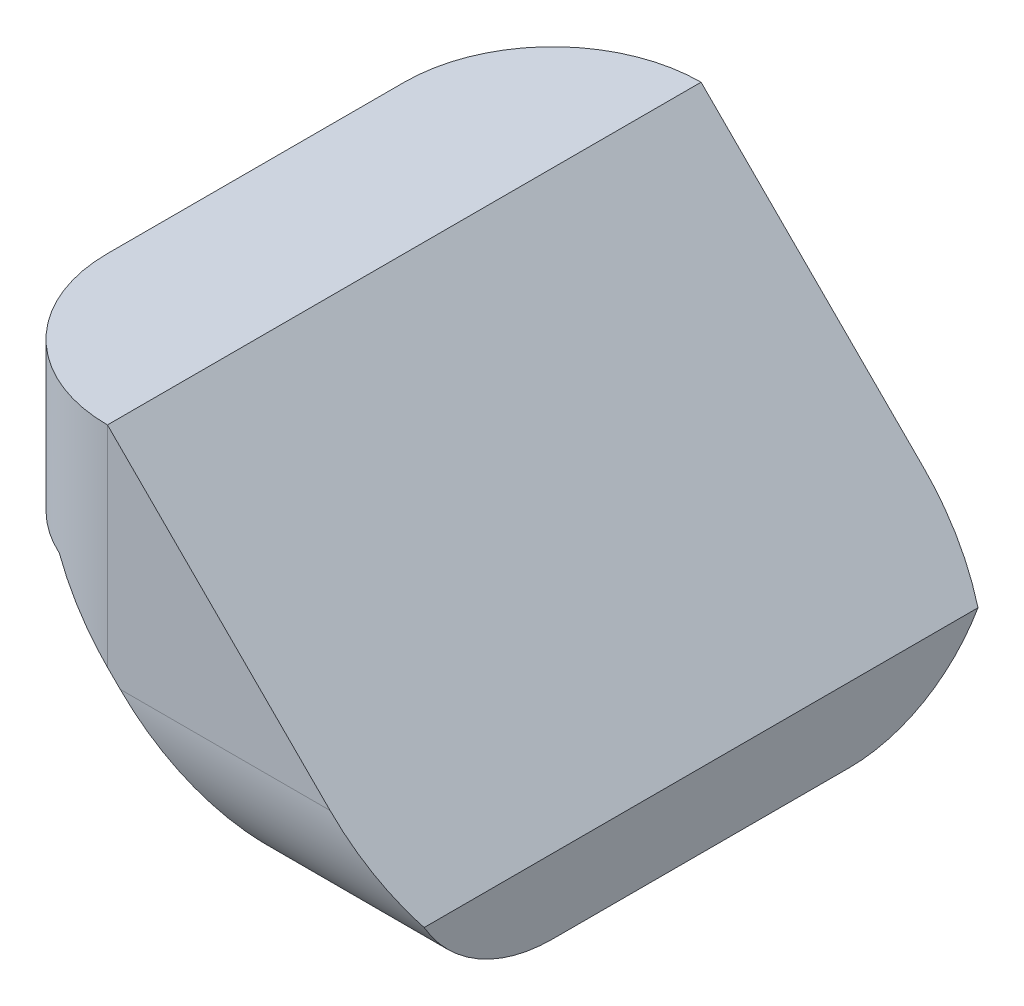
ISO-10303-21;
HEADER;
FILE_DESCRIPTION(('STEP AP214'),'2;1');
FILE_NAME('part.step','',(''),(''),'','','');
FILE_SCHEMA(('AUTOMOTIVE_DESIGN { 1 0 10303 214 1 1 1 1 }'));
ENDSEC;
DATA;
#1=APPLICATION_CONTEXT('core data for automotive mechanical design processes');
#2=APPLICATION_PROTOCOL_DEFINITION('international standard','automotive_design',2000,#1);
#3=PRODUCT_CONTEXT('',#1,'mechanical');
#4=PRODUCT('Part','Part','',(#3));
#5=PRODUCT_RELATED_PRODUCT_CATEGORY('part','',(#4));
#6=PRODUCT_DEFINITION_FORMATION('','',#4);
#7=PRODUCT_DEFINITION_CONTEXT('part definition',#1,'design');
#8=PRODUCT_DEFINITION('design','',#6,#7);
#9=PRODUCT_DEFINITION_SHAPE('','',#8);
#10=(LENGTH_UNIT() NAMED_UNIT(*) SI_UNIT(.MILLI.,.METRE.));
#11=(NAMED_UNIT(*) PLANE_ANGLE_UNIT() SI_UNIT($,.RADIAN.));
#12=(NAMED_UNIT(*) SI_UNIT($,.STERADIAN.) SOLID_ANGLE_UNIT());
#13=UNCERTAINTY_MEASURE_WITH_UNIT(LENGTH_MEASURE(1.E-05),#10,'distance_accuracy_value','');
#14=(GEOMETRIC_REPRESENTATION_CONTEXT(3) GLOBAL_UNCERTAINTY_ASSIGNED_CONTEXT((#13)) GLOBAL_UNIT_ASSIGNED_CONTEXT((#10,
#11,#12)) REPRESENTATION_CONTEXT('',''));
#15=CARTESIAN_POINT('',(0.,0.,0.));
#16=DIRECTION('',(0.,0.,1.));
#17=DIRECTION('',(1.,0.,0.));
#18=AXIS2_PLACEMENT_3D('',#15,#16,#17);
#19=CARTESIAN_POINT('',(-6.105,-0.06,4.095));
#20=DIRECTION('',(0.,-1.,0.));
#21=DIRECTION('',(0.,0.,-1.));
#22=AXIS2_PLACEMENT_3D('',#19,#20,#21);
#23=PLANE('',#22);
#24=CARTESIAN_POINT('',(-3.96,-0.06,1.95000000000028));
#25=DIRECTION('',(0.,1.,0.));
#26=DIRECTION('',(1.,0.,0.));
#27=AXIS2_PLACEMENT_3D('',#24,#25,#26);
#28=CIRCLE('',#27,1.95);
#29=CARTESIAN_POINT('',(-3.95999999999999,-0.06,3.90000000000029));
#30=VERTEX_POINT('',#29);
#31=CARTESIAN_POINT('',(-5.91,-0.06,1.95000000000028));
#32=VERTEX_POINT('',#31);
#33=EDGE_CURVE('E136',#30,#32,#28,.F.);
#34=ORIENTED_EDGE('',*,*,#33,.F.);
#35=DIRECTION('',(0.,0.,-1.));
#36=VECTOR('',#35,1.);
#37=CARTESIAN_POINT('',(-3.96,-0.06,4.095));
#38=LINE('',#37,#36);
#39=CARTESIAN_POINT('',(-3.95999999999999,-0.06,-3.89999999999972));
#40=VERTEX_POINT('',#39);
#41=EDGE_CURVE('E131',#30,#40,#38,.T.);
#42=ORIENTED_EDGE('',*,*,#41,.T.);
#43=CARTESIAN_POINT('',(-3.96,-0.06,-1.94999999999972));
#44=DIRECTION('',(0.,1.,0.));
#45=DIRECTION('',(1.,0.,0.));
#46=AXIS2_PLACEMENT_3D('',#43,#44,#45);
#47=CIRCLE('',#46,1.95);
#48=CARTESIAN_POINT('',(-5.91,-0.06,-1.94999999999972));
#49=VERTEX_POINT('',#48);
#50=EDGE_CURVE('E103',#49,#40,#47,.F.);
#51=ORIENTED_EDGE('',*,*,#50,.F.);
#52=DIRECTION('',(0.,0.,1.));
#53=VECTOR('',#52,1.);
#54=CARTESIAN_POINT('',(-5.91,-0.06,-3.89999999999972));
#55=LINE('',#54,#53);
#56=EDGE_CURVE('E40',#49,#32,#55,.T.);
#57=ORIENTED_EDGE('',*,*,#56,.T.);
#58=EDGE_LOOP('',(#34,#42,#51,#57));
#59=FACE_BOUND('',#58,.T.);
#60=ADVANCED_FACE('F17',(#59),#23,.F.);
#61=CARTESIAN_POINT('',(-3.96,-0.06,4.095));
#62=DIRECTION('',(-0.707106781186548,-0.707106781186548,0.));
#63=DIRECTION('',(0.707106781186548,-0.707106781186548,0.));
#64=AXIS2_PLACEMENT_3D('',#61,#62,#63);
#65=PLANE('',#64);
#66=DIRECTION('',(0.707106781186546,-0.707106781186549,0.));
#67=VECTOR('',#66,1.);
#68=CARTESIAN_POINT('',(-3.95999999999999,-0.06,3.90000000000028));
#69=LINE('',#68,#67);
#70=CARTESIAN_POINT('',(-1.035,-2.985,3.90000000000028));
#71=VERTEX_POINT('',#70);
#72=EDGE_CURVE('E187',#30,#71,#69,.T.);
#73=ORIENTED_EDGE('',*,*,#72,.T.);
#74=CARTESIAN_POINT('',(-1.03500000000001,-2.985,1.95000000000028));
#75=DIRECTION('',(0.707106781186549,0.707106781186546,0.));
#76=DIRECTION('',(0.707106781186546,-0.707106781186549,0.));
#77=AXIS2_PLACEMENT_3D('',#74,#75,#76);
#78=ELLIPSE('',#77,2.75771644662753,1.95);
#79=CARTESIAN_POINT('',(-0.06,-3.96,3.63874953737993));
#80=VERTEX_POINT('',#79);
#81=EDGE_CURVE('E201',#80,#71,#78,.F.);
#82=ORIENTED_EDGE('',*,*,#81,.F.);
#83=DIRECTION('',(0.,0.,-1.));
#84=VECTOR('',#83,1.);
#85=CARTESIAN_POINT('',(-0.06,-3.96,4.095));
#86=LINE('',#85,#84);
#87=CARTESIAN_POINT('',(-0.06,-3.96,-3.63874953737937));
#88=VERTEX_POINT('',#87);
#89=EDGE_CURVE('E137',#80,#88,#86,.T.);
#90=ORIENTED_EDGE('',*,*,#89,.T.);
#91=CARTESIAN_POINT('',(-1.03500000000001,-2.985,-1.94999999999972));
#92=DIRECTION('',(0.707106781186549,0.707106781186546,0.));
#93=DIRECTION('',(-0.707106781186546,0.707106781186549,0.));
#94=AXIS2_PLACEMENT_3D('',#91,#92,#93);
#95=ELLIPSE('',#94,2.75771644662753,1.95);
#96=CARTESIAN_POINT('',(-1.035,-2.985,-3.89999999999972));
#97=VERTEX_POINT('',#96);
#98=EDGE_CURVE('E133',#97,#88,#95,.F.);
#99=ORIENTED_EDGE('',*,*,#98,.F.);
#100=DIRECTION('',(-0.707106781186546,0.707106781186549,0.));
#101=VECTOR('',#100,1.);
#102=CARTESIAN_POINT('',(-3.95999999999999,-0.06,-3.89999999999972));
#103=LINE('',#102,#101);
#104=EDGE_CURVE('E119',#97,#40,#103,.T.);
#105=ORIENTED_EDGE('',*,*,#104,.T.);
#106=ORIENTED_EDGE('',*,*,#41,.F.);
#107=EDGE_LOOP('',(#73,#82,#90,#99,#105,#106));
#108=FACE_BOUND('',#107,.T.);
#109=ADVANCED_FACE('F130',(#108),#65,.F.);
#110=CARTESIAN_POINT('',(-0.06,-3.96,4.095));
#111=DIRECTION('',(-1.,0.,0.));
#112=DIRECTION('',(0.,0.,1.));
#113=AXIS2_PLACEMENT_3D('',#110,#111,#112);
#114=PLANE('',#113);
#115=CARTESIAN_POINT('',(-0.06,-2.985,1.95000000000028));
#116=DIRECTION('',(-1.,0.,0.));
#117=DIRECTION('',(0.,0.,1.));
#118=AXIS2_PLACEMENT_3D('',#115,#116,#117);
#119=CIRCLE('',#118,1.95);
#120=CARTESIAN_POINT('',(-0.0600000000000068,-4.935,1.95000000000028));
#121=VERTEX_POINT('',#120);
#122=EDGE_CURVE('E199',#121,#80,#119,.T.);
#123=ORIENTED_EDGE('',*,*,#122,.F.);
#124=DIRECTION('',(0.,0.,-1.));
#125=VECTOR('',#124,1.);
#126=CARTESIAN_POINT('',(-0.0600000000000068,-4.935,-3.89999999999972));
#127=LINE('',#126,#125);
#128=CARTESIAN_POINT('',(-0.0600000000000068,-4.935,-1.94999999999972));
#129=VERTEX_POINT('',#128);
#130=EDGE_CURVE('E208',#121,#129,#127,.T.);
#131=ORIENTED_EDGE('',*,*,#130,.T.);
#132=CARTESIAN_POINT('',(-0.06,-2.985,-1.94999999999972));
#133=DIRECTION('',(-1.,0.,0.));
#134=DIRECTION('',(0.,0.,1.));
#135=AXIS2_PLACEMENT_3D('',#132,#133,#134);
#136=CIRCLE('',#135,1.95);
#137=EDGE_CURVE('E160',#88,#129,#136,.T.);
#138=ORIENTED_EDGE('',*,*,#137,.F.);
#139=ORIENTED_EDGE('',*,*,#89,.F.);
#140=EDGE_LOOP('',(#123,#131,#138,#139));
#141=FACE_BOUND('',#140,.T.);
#142=ADVANCED_FACE('F216',(#141),#114,.F.);
#143=CARTESIAN_POINT('',(-5.91,-4.935,-3.89999999999972));
#144=DIRECTION('',(-1.,0.,0.));
#145=DIRECTION('',(0.,0.,1.));
#146=AXIS2_PLACEMENT_3D('',#143,#144,#145);
#147=PLANE('',#146);
#148=ORIENTED_EDGE('',*,*,#56,.F.);
#149=DIRECTION('',(0.,1.,0.));
#150=VECTOR('',#149,1.);
#151=CARTESIAN_POINT('',(-5.91,-0.06,-1.94999999999972));
#152=LINE('',#151,#150);
#153=CARTESIAN_POINT('',(-5.91,-2.01,-1.94999999999972));
#154=VERTEX_POINT('',#153);
#155=EDGE_CURVE('E108',#154,#49,#152,.T.);
#156=ORIENTED_EDGE('',*,*,#155,.F.);
#157=DIRECTION('',(0.,0.,1.));
#158=VECTOR('',#157,1.);
#159=CARTESIAN_POINT('',(-5.91,-2.01,-28.2749999999997));
#160=LINE('',#159,#158);
#161=CARTESIAN_POINT('',(-5.91,-2.01,1.95000000000028));
#162=VERTEX_POINT('',#161);
#163=EDGE_CURVE('E175',#154,#162,#160,.T.);
#164=ORIENTED_EDGE('',*,*,#163,.T.);
#165=DIRECTION('',(0.,1.,0.));
#166=VECTOR('',#165,1.);
#167=CARTESIAN_POINT('',(-5.91,-2.01,1.95000000000028));
#168=LINE('',#167,#166);
#169=EDGE_CURVE('E197',#32,#162,#168,.F.);
#170=ORIENTED_EDGE('',*,*,#169,.F.);
#171=EDGE_LOOP('',(#148,#156,#164,#170));
#172=FACE_BOUND('',#171,.T.);
#173=ADVANCED_FACE('F224',(#172),#147,.T.);
#174=CARTESIAN_POINT('',(-0.0600000000000068,-4.935,-3.89999999999972));
#175=DIRECTION('',(0.,0.,-1.));
#176=DIRECTION('',(-1.,0.,0.));
#177=AXIS2_PLACEMENT_3D('',#174,#175,#176);
#178=PLANE('',#177);
#179=DIRECTION('',(-0.707106781186546,0.707106781186549,0.));
#180=VECTOR('',#179,1.);
#181=CARTESIAN_POINT('',(-2.01000000000001,-4.76771644662753,-3.89999999999972));
#182=LINE('',#181,#180);
#183=CARTESIAN_POINT('',(-3.79271644662754,-2.985,-3.89999999999972));
#184=VERTEX_POINT('',#183);
#185=CARTESIAN_POINT('',(-3.96,-2.81771644662753,-3.89999999999972));
#186=VERTEX_POINT('',#185);
#187=EDGE_CURVE('E122',#184,#186,#182,.T.);
#188=ORIENTED_EDGE('',*,*,#187,.T.);
#189=DIRECTION('',(0.,1.,0.));
#190=VECTOR('',#189,1.);
#191=CARTESIAN_POINT('',(-3.96,-2.01,-3.89999999999972));
#192=LINE('',#191,#190);
#193=EDGE_CURVE('E106',#40,#186,#192,.F.);
#194=ORIENTED_EDGE('',*,*,#193,.F.);
#195=ORIENTED_EDGE('',*,*,#104,.F.);
#196=DIRECTION('',(-1.,0.,0.));
#197=VECTOR('',#196,1.);
#198=CARTESIAN_POINT('',(-0.0600000000000068,-2.985,-3.89999999999972));
#199=LINE('',#198,#197);
#200=EDGE_CURVE('E124',#184,#97,#199,.F.);
#201=ORIENTED_EDGE('',*,*,#200,.F.);
#202=EDGE_LOOP('',(#188,#194,#195,#201));
#203=FACE_BOUND('',#202,.T.);
#204=ADVANCED_FACE('F117',(#203),#178,.T.);
#205=CARTESIAN_POINT('',(-0.0600000000000068,-4.935,3.90000000000028));
#206=DIRECTION('',(0.,0.,1.));
#207=DIRECTION('',(1.,0.,0.));
#208=AXIS2_PLACEMENT_3D('',#205,#206,#207);
#209=PLANE('',#208);
#210=ORIENTED_EDGE('',*,*,#72,.F.);
#211=DIRECTION('',(0.,1.,0.));
#212=VECTOR('',#211,1.);
#213=CARTESIAN_POINT('',(-3.96,-0.06,3.90000000000028));
#214=LINE('',#213,#212);
#215=CARTESIAN_POINT('',(-3.96,-2.81771644662753,3.90000000000028));
#216=VERTEX_POINT('',#215);
#217=EDGE_CURVE('E182',#216,#30,#214,.T.);
#218=ORIENTED_EDGE('',*,*,#217,.F.);
#219=DIRECTION('',(0.707106781186546,-0.707106781186549,0.));
#220=VECTOR('',#219,1.);
#221=CARTESIAN_POINT('',(-2.01000000000001,-4.76771644662753,3.90000000000028));
#222=LINE('',#221,#220);
#223=CARTESIAN_POINT('',(-3.79271644662754,-2.985,3.90000000000028));
#224=VERTEX_POINT('',#223);
#225=EDGE_CURVE('E178',#216,#224,#222,.T.);
#226=ORIENTED_EDGE('',*,*,#225,.T.);
#227=DIRECTION('',(1.,0.,0.));
#228=VECTOR('',#227,1.);
#229=CARTESIAN_POINT('',(-0.0600000000000068,-2.985,3.90000000000028));
#230=LINE('',#229,#228);
#231=EDGE_CURVE('E125',#71,#224,#230,.F.);
#232=ORIENTED_EDGE('',*,*,#231,.F.);
#233=EDGE_LOOP('',(#210,#218,#226,#232));
#234=FACE_BOUND('',#233,.T.);
#235=ADVANCED_FACE('F185',(#234),#209,.T.);
#236=CARTESIAN_POINT('',(-54.1560238568588,-4.935,0.164761431411837));
#237=DIRECTION('',(0.,1.,0.));
#238=DIRECTION('',(1.,0.,0.));
#239=AXIS2_PLACEMENT_3D('',#236,#237,#238);
#240=PLANE('',#239);
#241=DIRECTION('',(0.,0.,1.));
#242=VECTOR('',#241,1.);
#243=CARTESIAN_POINT('',(-2.01000000000001,-4.935,-28.2749999999997));
#244=LINE('',#243,#242);
#245=CARTESIAN_POINT('',(-2.01,-4.935,-1.94999999999972));
#246=VERTEX_POINT('',#245);
#247=CARTESIAN_POINT('',(-2.01,-4.935,1.95000000000028));
#248=VERTEX_POINT('',#247);
#249=EDGE_CURVE('E32',#246,#248,#244,.T.);
#250=ORIENTED_EDGE('',*,*,#249,.F.);
#251=DIRECTION('',(-1.,0.,0.));
#252=VECTOR('',#251,1.);
#253=CARTESIAN_POINT('',(-54.1560238568588,-4.935,-1.94999999999972));
#254=LINE('',#253,#252);
#255=EDGE_CURVE('E191',#129,#246,#254,.T.);
#256=ORIENTED_EDGE('',*,*,#255,.F.);
#257=ORIENTED_EDGE('',*,*,#130,.F.);
#258=DIRECTION('',(1.,0.,0.));
#259=VECTOR('',#258,1.);
#260=CARTESIAN_POINT('',(-54.1560238568588,-4.935,1.95000000000028));
#261=LINE('',#260,#259);
#262=EDGE_CURVE('E188',#248,#121,#261,.T.);
#263=ORIENTED_EDGE('',*,*,#262,.F.);
#264=EDGE_LOOP('',(#250,#256,#257,#263));
#265=FACE_BOUND('',#264,.T.);
#266=ADVANCED_FACE('F206',(#265),#240,.F.);
#267=CARTESIAN_POINT('',(-54.1560238568588,-2.985,1.95000000000028));
#268=DIRECTION('',(1.,0.,0.));
#269=DIRECTION('',(0.,0.,-1.));
#270=AXIS2_PLACEMENT_3D('',#267,#268,#269);
#271=CYLINDRICAL_SURFACE('',#270,1.95);
#272=CARTESIAN_POINT('',(-3.79271644662753,-2.985,1.95000000000028));
#273=DIRECTION('',(0.707106781186549,0.707106781186546,0.));
#274=DIRECTION('',(0.707106781186546,-0.707106781186549,0.));
#275=AXIS2_PLACEMENT_3D('',#272,#273,#274);
#276=ELLIPSE('',#275,2.75771644662753,1.95);
#277=CARTESIAN_POINT('',(-2.01,-4.76771644662753,2.74020381606528));
#278=VERTEX_POINT('',#277);
#279=EDGE_CURVE('E156',#224,#278,#276,.T.);
#280=ORIENTED_EDGE('',*,*,#279,.T.);
#281=CARTESIAN_POINT('',(-2.01,-2.985,1.95000000000028));
#282=DIRECTION('',(1.,0.,0.));
#283=DIRECTION('',(0.,0.,-1.));
#284=AXIS2_PLACEMENT_3D('',#281,#282,#283);
#285=CIRCLE('',#284,1.95);
#286=EDGE_CURVE('E150',#278,#248,#285,.T.);
#287=ORIENTED_EDGE('',*,*,#286,.T.);
#288=ORIENTED_EDGE('',*,*,#262,.T.);
#289=ORIENTED_EDGE('',*,*,#122,.T.);
#290=ORIENTED_EDGE('',*,*,#81,.T.);
#291=ORIENTED_EDGE('',*,*,#231,.T.);
#292=EDGE_LOOP('',(#280,#287,#288,#289,#290,#291));
#293=FACE_BOUND('',#292,.T.);
#294=ADVANCED_FACE('F204',(#293),#271,.T.);
#295=CARTESIAN_POINT('',(-54.1560238568588,-2.985,-1.94999999999972));
#296=DIRECTION('',(-1.,0.,0.));
#297=DIRECTION('',(0.,0.,1.));
#298=AXIS2_PLACEMENT_3D('',#295,#296,#297);
#299=CYLINDRICAL_SURFACE('',#298,1.95);
#300=ORIENTED_EDGE('',*,*,#98,.T.);
#301=ORIENTED_EDGE('',*,*,#137,.T.);
#302=ORIENTED_EDGE('',*,*,#255,.T.);
#303=CARTESIAN_POINT('',(-2.01000000000001,-2.985,-1.94999999999972));
#304=DIRECTION('',(1.,0.,0.));
#305=DIRECTION('',(0.,0.,-1.));
#306=AXIS2_PLACEMENT_3D('',#303,#304,#305);
#307=CIRCLE('',#306,1.95);
#308=CARTESIAN_POINT('',(-2.01000000000001,-4.76771644662753,-2.74020381606471));
#309=VERTEX_POINT('',#308);
#310=EDGE_CURVE('E149',#246,#309,#307,.T.);
#311=ORIENTED_EDGE('',*,*,#310,.T.);
#312=CARTESIAN_POINT('',(-3.79271644662753,-2.985,-1.94999999999972));
#313=DIRECTION('',(0.707106781186549,0.707106781186546,0.));
#314=DIRECTION('',(-0.707106781186546,0.707106781186549,0.));
#315=AXIS2_PLACEMENT_3D('',#312,#313,#314);
#316=ELLIPSE('',#315,2.75771644662753,1.95);
#317=EDGE_CURVE('E157',#309,#184,#316,.T.);
#318=ORIENTED_EDGE('',*,*,#317,.T.);
#319=ORIENTED_EDGE('',*,*,#200,.T.);
#320=EDGE_LOOP('',(#300,#301,#302,#311,#318,#319));
#321=FACE_BOUND('',#320,.T.);
#322=ADVANCED_FACE('F213',(#321),#299,.T.);
#323=CARTESIAN_POINT('',(-3.96,-4.935,1.95000000000028));
#324=DIRECTION('',(0.,-1.,0.));
#325=DIRECTION('',(-1.,0.,0.));
#326=AXIS2_PLACEMENT_3D('',#323,#324,#325);
#327=CYLINDRICAL_SURFACE('',#326,1.95);
#328=CARTESIAN_POINT('',(-3.96,-2.01,1.95000000000028));
#329=DIRECTION('',(0.,1.,0.));
#330=DIRECTION('',(1.,0.,0.));
#331=AXIS2_PLACEMENT_3D('',#328,#329,#330);
#332=CIRCLE('',#331,1.95);
#333=CARTESIAN_POINT('',(-4.76771644662752,-2.01,3.72485045619298));
#334=VERTEX_POINT('',#333);
#335=EDGE_CURVE('E167',#162,#334,#332,.T.);
#336=ORIENTED_EDGE('',*,*,#335,.T.);
#337=CARTESIAN_POINT('',(-3.96,-2.81771644662753,1.95000000000028));
#338=DIRECTION('',(0.707106781186549,0.707106781186546,0.));
#339=DIRECTION('',(0.707106781186546,-0.707106781186549,0.));
#340=AXIS2_PLACEMENT_3D('',#337,#338,#339);
#341=ELLIPSE('',#340,2.75771644662754,1.95);
#342=EDGE_CURVE('E112',#334,#216,#341,.T.);
#343=ORIENTED_EDGE('',*,*,#342,.T.);
#344=ORIENTED_EDGE('',*,*,#217,.T.);
#345=ORIENTED_EDGE('',*,*,#33,.T.);
#346=ORIENTED_EDGE('',*,*,#169,.T.);
#347=EDGE_LOOP('',(#336,#343,#344,#345,#346));
#348=FACE_BOUND('',#347,.T.);
#349=ADVANCED_FACE('F181',(#348),#327,.T.);
#350=CARTESIAN_POINT('',(-3.96,-4.935,-1.94999999999972));
#351=DIRECTION('',(0.,-1.,0.));
#352=DIRECTION('',(-1.,0.,0.));
#353=AXIS2_PLACEMENT_3D('',#350,#351,#352);
#354=CYLINDRICAL_SURFACE('',#353,1.95);
#355=CARTESIAN_POINT('',(-3.96,-2.81771644662753,-1.94999999999972));
#356=DIRECTION('',(0.707106781186549,0.707106781186546,0.));
#357=DIRECTION('',(0.707106781186546,-0.707106781186549,0.));
#358=AXIS2_PLACEMENT_3D('',#355,#356,#357);
#359=ELLIPSE('',#358,2.75771644662754,1.95);
#360=CARTESIAN_POINT('',(-4.76771644662753,-2.01,-3.72485045619241));
#361=VERTEX_POINT('',#360);
#362=EDGE_CURVE('E111',#186,#361,#359,.T.);
#363=ORIENTED_EDGE('',*,*,#362,.T.);
#364=CARTESIAN_POINT('',(-3.96,-2.01,-1.94999999999972));
#365=DIRECTION('',(0.,1.,0.));
#366=DIRECTION('',(1.,0.,0.));
#367=AXIS2_PLACEMENT_3D('',#364,#365,#366);
#368=CIRCLE('',#367,1.95);
#369=EDGE_CURVE('E138',#361,#154,#368,.T.);
#370=ORIENTED_EDGE('',*,*,#369,.T.);
#371=ORIENTED_EDGE('',*,*,#155,.T.);
#372=ORIENTED_EDGE('',*,*,#50,.T.);
#373=ORIENTED_EDGE('',*,*,#193,.T.);
#374=EDGE_LOOP('',(#363,#370,#371,#372,#373));
#375=FACE_BOUND('',#374,.T.);
#376=ADVANCED_FACE('F105',(#375),#354,.T.);
#377=CARTESIAN_POINT('',(-4.76771644662754,-2.01,4.095));
#378=DIRECTION('',(0.,1.,0.));
#379=DIRECTION('',(0.,0.,1.));
#380=AXIS2_PLACEMENT_3D('',#377,#378,#379);
#381=PLANE('',#380);
#382=ORIENTED_EDGE('',*,*,#335,.F.);
#383=ORIENTED_EDGE('',*,*,#163,.F.);
#384=ORIENTED_EDGE('',*,*,#369,.F.);
#385=DIRECTION('',(0.,0.,-1.));
#386=VECTOR('',#385,1.);
#387=CARTESIAN_POINT('',(-4.76771644662754,-2.01,4.095));
#388=LINE('',#387,#386);
#389=EDGE_CURVE('E11',#334,#361,#388,.T.);
#390=ORIENTED_EDGE('',*,*,#389,.F.);
#391=EDGE_LOOP('',(#382,#383,#384,#390));
#392=FACE_BOUND('',#391,.T.);
#393=ADVANCED_FACE('F19',(#392),#381,.F.);
#394=CARTESIAN_POINT('',(-2.01,-4.76771644662754,4.095));
#395=DIRECTION('',(0.707106781186547,0.707106781186547,0.));
#396=DIRECTION('',(-0.707106781186548,0.707106781186548,0.));
#397=AXIS2_PLACEMENT_3D('',#394,#395,#396);
#398=PLANE('',#397);
#399=ORIENTED_EDGE('',*,*,#279,.F.);
#400=ORIENTED_EDGE('',*,*,#225,.F.);
#401=ORIENTED_EDGE('',*,*,#342,.F.);
#402=ORIENTED_EDGE('',*,*,#389,.T.);
#403=ORIENTED_EDGE('',*,*,#362,.F.);
#404=ORIENTED_EDGE('',*,*,#187,.F.);
#405=ORIENTED_EDGE('',*,*,#317,.F.);
#406=DIRECTION('',(0.,0.,-1.));
#407=VECTOR('',#406,1.);
#408=CARTESIAN_POINT('',(-2.01,-4.76771644662754,4.095));
#409=LINE('',#408,#407);
#410=EDGE_CURVE('E25',#278,#309,#409,.T.);
#411=ORIENTED_EDGE('',*,*,#410,.F.);
#412=EDGE_LOOP('',(#399,#400,#401,#402,#403,#404,#405,#411));
#413=FACE_BOUND('',#412,.T.);
#414=ADVANCED_FACE('F154',(#413),#398,.F.);
#415=CARTESIAN_POINT('',(-2.01,-5.13,4.095));
#416=DIRECTION('',(1.,0.,0.));
#417=DIRECTION('',(0.,0.,-1.));
#418=AXIS2_PLACEMENT_3D('',#415,#416,#417);
#419=PLANE('',#418);
#420=ORIENTED_EDGE('',*,*,#286,.F.);
#421=ORIENTED_EDGE('',*,*,#410,.T.);
#422=ORIENTED_EDGE('',*,*,#310,.F.);
#423=ORIENTED_EDGE('',*,*,#249,.T.);
#424=EDGE_LOOP('',(#420,#421,#422,#423));
#425=FACE_BOUND('',#424,.T.);
#426=ADVANCED_FACE('F148',(#425),#419,.F.);
#427=CLOSED_SHELL('',(#60,#109,#142,#173,#204,#235,#266,#294,#322,#349,#376,#393,#414,#426));
#428=MANIFOLD_SOLID_BREP('B1',#427);
#429=ADVANCED_BREP_SHAPE_REPRESENTATION('',(#18,#428),#14);
#430=SHAPE_DEFINITION_REPRESENTATION(#9,#429);
ENDSEC;
END-ISO-10303-21;
